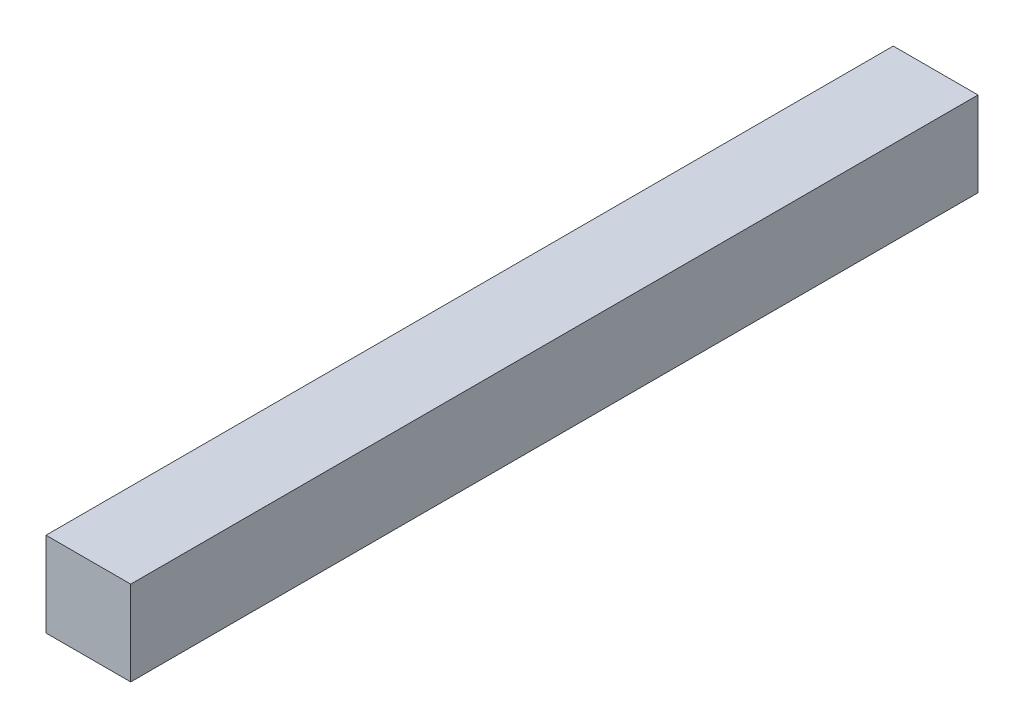
ISO-10303-21;
HEADER;
FILE_DESCRIPTION(('STEP AP214'),'2;1');
FILE_NAME('part.step','',(''),(''),'','','');
FILE_SCHEMA(('AUTOMOTIVE_DESIGN { 1 0 10303 214 1 1 1 1 }'));
ENDSEC;
DATA;
#1=APPLICATION_CONTEXT('core data for automotive mechanical design processes');
#2=APPLICATION_PROTOCOL_DEFINITION('international standard','automotive_design',2000,#1);
#3=PRODUCT_CONTEXT('',#1,'mechanical');
#4=PRODUCT('Part','Part','',(#3));
#5=PRODUCT_RELATED_PRODUCT_CATEGORY('part','',(#4));
#6=PRODUCT_DEFINITION_FORMATION('','',#4);
#7=PRODUCT_DEFINITION_CONTEXT('part definition',#1,'design');
#8=PRODUCT_DEFINITION('design','',#6,#7);
#9=PRODUCT_DEFINITION_SHAPE('','',#8);
#10=(LENGTH_UNIT() NAMED_UNIT(*) SI_UNIT(.MILLI.,.METRE.));
#11=(NAMED_UNIT(*) PLANE_ANGLE_UNIT() SI_UNIT($,.RADIAN.));
#12=(NAMED_UNIT(*) SI_UNIT($,.STERADIAN.) SOLID_ANGLE_UNIT());
#13=UNCERTAINTY_MEASURE_WITH_UNIT(LENGTH_MEASURE(1.E-05),#10,'distance_accuracy_value','');
#14=(GEOMETRIC_REPRESENTATION_CONTEXT(3) GLOBAL_UNCERTAINTY_ASSIGNED_CONTEXT((#13)) GLOBAL_UNIT_ASSIGNED_CONTEXT((#10,
#11,#12)) REPRESENTATION_CONTEXT('',''));
#15=CARTESIAN_POINT('',(0.,0.,0.));
#16=DIRECTION('',(0.,0.,1.));
#17=DIRECTION('',(1.,0.,0.));
#18=AXIS2_PLACEMENT_3D('',#15,#16,#17);
#19=CARTESIAN_POINT('',(15.,15.,150.));
#20=DIRECTION('',(-1.,0.,0.));
#21=DIRECTION('',(0.,0.,1.));
#22=AXIS2_PLACEMENT_3D('',#19,#20,#21);
#23=PLANE('',#22);
#24=DIRECTION('',(0.,1.,0.));
#25=VECTOR('',#24,1.);
#26=CARTESIAN_POINT('',(15.,15.,-150.));
#27=LINE('',#26,#25);
#28=CARTESIAN_POINT('',(15.,-15.,-150.));
#29=VERTEX_POINT('',#28);
#30=CARTESIAN_POINT('',(15.,15.,-150.));
#31=VERTEX_POINT('',#30);
#32=EDGE_CURVE('E98',#29,#31,#27,.T.);
#33=ORIENTED_EDGE('',*,*,#32,.T.);
#34=DIRECTION('',(0.,0.,-1.));
#35=VECTOR('',#34,1.);
#36=CARTESIAN_POINT('',(15.,15.,150.));
#37=LINE('',#36,#35);
#38=CARTESIAN_POINT('',(15.,15.,150.));
#39=VERTEX_POINT('',#38);
#40=EDGE_CURVE('E11',#39,#31,#37,.T.);
#41=ORIENTED_EDGE('',*,*,#40,.F.);
#42=DIRECTION('',(0.,1.,0.));
#43=VECTOR('',#42,1.);
#44=CARTESIAN_POINT('',(15.,15.,150.));
#45=LINE('',#44,#43);
#46=CARTESIAN_POINT('',(15.,-15.,150.));
#47=VERTEX_POINT('',#46);
#48=EDGE_CURVE('E86',#47,#39,#45,.T.);
#49=ORIENTED_EDGE('',*,*,#48,.F.);
#50=DIRECTION('',(0.,0.,-1.));
#51=VECTOR('',#50,1.);
#52=CARTESIAN_POINT('',(15.,-15.,150.));
#53=LINE('',#52,#51);
#54=EDGE_CURVE('E94',#47,#29,#53,.T.);
#55=ORIENTED_EDGE('',*,*,#54,.T.);
#56=EDGE_LOOP('',(#33,#41,#49,#55));
#57=FACE_BOUND('',#56,.T.);
#58=ADVANCED_FACE('F35',(#57),#23,.F.);
#59=CARTESIAN_POINT('',(-15.,15.,150.));
#60=DIRECTION('',(0.,-1.,0.));
#61=DIRECTION('',(0.,0.,-1.));
#62=AXIS2_PLACEMENT_3D('',#59,#60,#61);
#63=PLANE('',#62);
#64=DIRECTION('',(-1.,0.,0.));
#65=VECTOR('',#64,1.);
#66=CARTESIAN_POINT('',(-15.,15.,-150.));
#67=LINE('',#66,#65);
#68=CARTESIAN_POINT('',(-15.,15.,-150.));
#69=VERTEX_POINT('',#68);
#70=EDGE_CURVE('E90',#31,#69,#67,.T.);
#71=ORIENTED_EDGE('',*,*,#70,.T.);
#72=DIRECTION('',(0.,0.,-1.));
#73=VECTOR('',#72,1.);
#74=CARTESIAN_POINT('',(-15.,15.,150.));
#75=LINE('',#74,#73);
#76=CARTESIAN_POINT('',(-15.,15.,150.));
#77=VERTEX_POINT('',#76);
#78=EDGE_CURVE('E43',#77,#69,#75,.T.);
#79=ORIENTED_EDGE('',*,*,#78,.F.);
#80=DIRECTION('',(-1.,0.,0.));
#81=VECTOR('',#80,1.);
#82=CARTESIAN_POINT('',(-15.,15.,150.));
#83=LINE('',#82,#81);
#84=EDGE_CURVE('E81',#39,#77,#83,.T.);
#85=ORIENTED_EDGE('',*,*,#84,.F.);
#86=ORIENTED_EDGE('',*,*,#40,.T.);
#87=EDGE_LOOP('',(#71,#79,#85,#86));
#88=FACE_BOUND('',#87,.T.);
#89=ADVANCED_FACE('F89',(#88),#63,.F.);
#90=CARTESIAN_POINT('',(-15.,15.,150.));
#91=DIRECTION('',(1.,0.,0.));
#92=DIRECTION('',(0.,0.,-1.));
#93=AXIS2_PLACEMENT_3D('',#90,#91,#92);
#94=PLANE('',#93);
#95=DIRECTION('',(0.,-1.,0.));
#96=VECTOR('',#95,1.);
#97=CARTESIAN_POINT('',(-15.,15.,-150.));
#98=LINE('',#97,#96);
#99=CARTESIAN_POINT('',(-15.,-15.,-150.));
#100=VERTEX_POINT('',#99);
#101=EDGE_CURVE('E68',#69,#100,#98,.T.);
#102=ORIENTED_EDGE('',*,*,#101,.T.);
#103=DIRECTION('',(0.,0.,-1.));
#104=VECTOR('',#103,1.);
#105=CARTESIAN_POINT('',(-15.,-15.,150.));
#106=LINE('',#105,#104);
#107=CARTESIAN_POINT('',(-15.,-15.,150.));
#108=VERTEX_POINT('',#107);
#109=EDGE_CURVE('E91',#108,#100,#106,.T.);
#110=ORIENTED_EDGE('',*,*,#109,.F.);
#111=DIRECTION('',(0.,-1.,0.));
#112=VECTOR('',#111,1.);
#113=CARTESIAN_POINT('',(-15.,15.,150.));
#114=LINE('',#113,#112);
#115=EDGE_CURVE('E84',#77,#108,#114,.T.);
#116=ORIENTED_EDGE('',*,*,#115,.F.);
#117=ORIENTED_EDGE('',*,*,#78,.T.);
#118=EDGE_LOOP('',(#102,#110,#116,#117));
#119=FACE_BOUND('',#118,.T.);
#120=ADVANCED_FACE('F92',(#119),#94,.F.);
#121=CARTESIAN_POINT('',(-15.,-15.,150.));
#122=DIRECTION('',(0.,1.,0.));
#123=DIRECTION('',(0.,0.,1.));
#124=AXIS2_PLACEMENT_3D('',#121,#122,#123);
#125=PLANE('',#124);
#126=DIRECTION('',(1.,0.,0.));
#127=VECTOR('',#126,1.);
#128=CARTESIAN_POINT('',(-15.,-15.,-150.));
#129=LINE('',#128,#127);
#130=EDGE_CURVE('E74',#100,#29,#129,.T.);
#131=ORIENTED_EDGE('',*,*,#130,.T.);
#132=ORIENTED_EDGE('',*,*,#54,.F.);
#133=DIRECTION('',(1.,0.,0.));
#134=VECTOR('',#133,1.);
#135=CARTESIAN_POINT('',(-15.,-15.,150.));
#136=LINE('',#135,#134);
#137=EDGE_CURVE('E51',#108,#47,#136,.T.);
#138=ORIENTED_EDGE('',*,*,#137,.F.);
#139=ORIENTED_EDGE('',*,*,#109,.T.);
#140=EDGE_LOOP('',(#131,#132,#138,#139));
#141=FACE_BOUND('',#140,.T.);
#142=ADVANCED_FACE('F105',(#141),#125,.F.);
#143=CARTESIAN_POINT('',(0.,0.,150.));
#144=DIRECTION('',(0.,0.,1.));
#145=DIRECTION('',(1.,0.,0.));
#146=AXIS2_PLACEMENT_3D('',#143,#144,#145);
#147=PLANE('',#146);
#148=ORIENTED_EDGE('',*,*,#48,.T.);
#149=ORIENTED_EDGE('',*,*,#84,.T.);
#150=ORIENTED_EDGE('',*,*,#115,.T.);
#151=ORIENTED_EDGE('',*,*,#137,.T.);
#152=EDGE_LOOP('',(#148,#149,#150,#151));
#153=FACE_BOUND('',#152,.T.);
#154=ADVANCED_FACE('F82',(#153),#147,.T.);
#155=CARTESIAN_POINT('',(0.,0.,-150.));
#156=DIRECTION('',(0.,0.,1.));
#157=DIRECTION('',(1.,0.,0.));
#158=AXIS2_PLACEMENT_3D('',#155,#156,#157);
#159=PLANE('',#158);
#160=ORIENTED_EDGE('',*,*,#32,.F.);
#161=ORIENTED_EDGE('',*,*,#130,.F.);
#162=ORIENTED_EDGE('',*,*,#101,.F.);
#163=ORIENTED_EDGE('',*,*,#70,.F.);
#164=EDGE_LOOP('',(#160,#161,#162,#163));
#165=FACE_BOUND('',#164,.T.);
#166=ADVANCED_FACE('F108',(#165),#159,.F.);
#167=CLOSED_SHELL('',(#58,#89,#120,#142,#154,#166));
#168=MANIFOLD_SOLID_BREP('B2',#167);
#169=ADVANCED_BREP_SHAPE_REPRESENTATION('',(#18,#168),#14);
#170=SHAPE_DEFINITION_REPRESENTATION(#9,#169);
ENDSEC;
END-ISO-10303-21;
